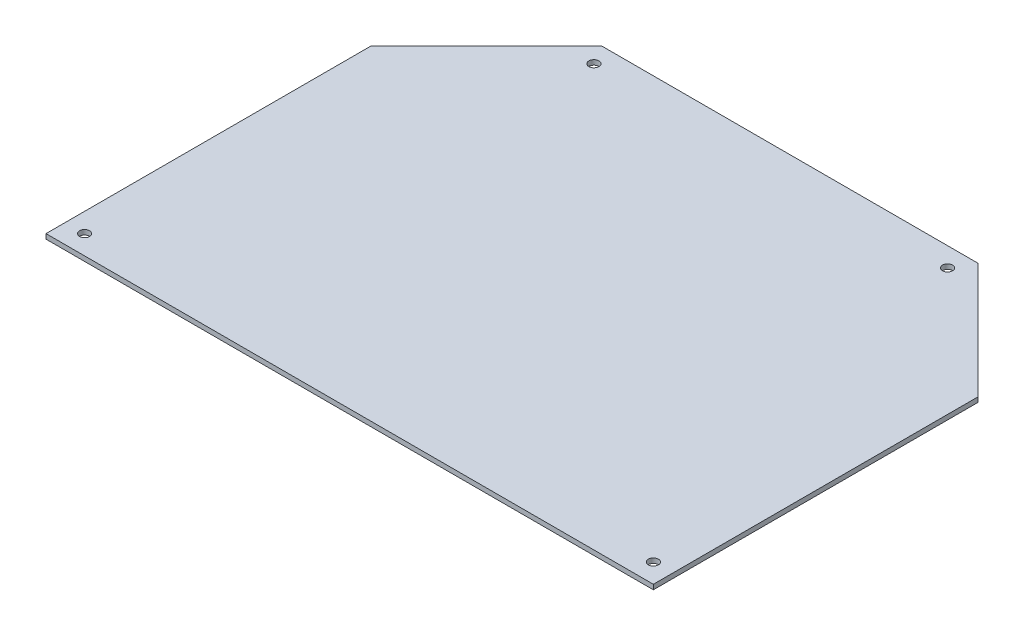
ISO-10303-21;
HEADER;
FILE_DESCRIPTION(('STEP AP214'),'2;1');
FILE_NAME('part.step','',(''),(''),'','','');
FILE_SCHEMA(('AUTOMOTIVE_DESIGN { 1 0 10303 214 1 1 1 1 }'));
ENDSEC;
DATA;
#1=APPLICATION_CONTEXT('core data for automotive mechanical design processes');
#2=APPLICATION_PROTOCOL_DEFINITION('international standard','automotive_design',2000,#1);
#3=PRODUCT_CONTEXT('',#1,'mechanical');
#4=PRODUCT('Part','Part','',(#3));
#5=PRODUCT_RELATED_PRODUCT_CATEGORY('part','',(#4));
#6=PRODUCT_DEFINITION_FORMATION('','',#4);
#7=PRODUCT_DEFINITION_CONTEXT('part definition',#1,'design');
#8=PRODUCT_DEFINITION('design','',#6,#7);
#9=PRODUCT_DEFINITION_SHAPE('','',#8);
#10=(LENGTH_UNIT() NAMED_UNIT(*) SI_UNIT(.MILLI.,.METRE.));
#11=(NAMED_UNIT(*) PLANE_ANGLE_UNIT() SI_UNIT($,.RADIAN.));
#12=(NAMED_UNIT(*) SI_UNIT($,.STERADIAN.) SOLID_ANGLE_UNIT());
#13=UNCERTAINTY_MEASURE_WITH_UNIT(LENGTH_MEASURE(1.E-05),#10,'distance_accuracy_value','');
#14=(GEOMETRIC_REPRESENTATION_CONTEXT(3) GLOBAL_UNCERTAINTY_ASSIGNED_CONTEXT((#13)) GLOBAL_UNIT_ASSIGNED_CONTEXT((#10,
#11,#12)) REPRESENTATION_CONTEXT('',''));
#15=CARTESIAN_POINT('',(0.,0.,0.));
#16=DIRECTION('',(0.,0.,1.));
#17=DIRECTION('',(1.,0.,0.));
#18=AXIS2_PLACEMENT_3D('',#15,#16,#17);
#19=CARTESIAN_POINT('',(200.,-3.175,145.));
#20=DIRECTION('',(1.,0.,0.));
#21=DIRECTION('',(0.,0.,-1.));
#22=AXIS2_PLACEMENT_3D('',#19,#20,#21);
#23=PLANE('',#22);
#24=DIRECTION('',(0.,1.,0.));
#25=VECTOR('',#24,1.);
#26=CARTESIAN_POINT('',(200.,-10.,-68.8));
#27=LINE('',#26,#25);
#28=CARTESIAN_POINT('',(200.,-3.175,-68.8));
#29=VERTEX_POINT('',#28);
#30=CARTESIAN_POINT('',(200.,0.,-68.8));
#31=VERTEX_POINT('',#30);
#32=EDGE_CURVE('E92',#29,#31,#27,.T.);
#33=ORIENTED_EDGE('',*,*,#32,.T.);
#34=DIRECTION('',(0.,0.,-1.));
#35=VECTOR('',#34,1.);
#36=CARTESIAN_POINT('',(200.,0.,145.));
#37=LINE('',#36,#35);
#38=CARTESIAN_POINT('',(200.,0.,145.));
#39=VERTEX_POINT('',#38);
#40=EDGE_CURVE('E103',#39,#31,#37,.T.);
#41=ORIENTED_EDGE('',*,*,#40,.F.);
#42=DIRECTION('',(0.,1.,0.));
#43=VECTOR('',#42,1.);
#44=CARTESIAN_POINT('',(200.,-3.175,145.));
#45=LINE('',#44,#43);
#46=CARTESIAN_POINT('',(200.,-3.175,145.));
#47=VERTEX_POINT('',#46);
#48=EDGE_CURVE('E11',#47,#39,#45,.T.);
#49=ORIENTED_EDGE('',*,*,#48,.F.);
#50=DIRECTION('',(0.,0.,-1.));
#51=VECTOR('',#50,1.);
#52=CARTESIAN_POINT('',(200.,-3.175,145.));
#53=LINE('',#52,#51);
#54=EDGE_CURVE('E106',#47,#29,#53,.T.);
#55=ORIENTED_EDGE('',*,*,#54,.T.);
#56=EDGE_LOOP('',(#33,#41,#49,#55));
#57=FACE_BOUND('',#56,.T.);
#58=ADVANCED_FACE('F39',(#57),#23,.T.);
#59=CARTESIAN_POINT('',(-200.,-3.175,145.));
#60=DIRECTION('',(0.,0.,1.));
#61=DIRECTION('',(1.,0.,0.));
#62=AXIS2_PLACEMENT_3D('',#59,#60,#61);
#63=PLANE('',#62);
#64=DIRECTION('',(1.,0.,0.));
#65=VECTOR('',#64,1.);
#66=CARTESIAN_POINT('',(-200.,0.,145.));
#67=LINE('',#66,#65);
#68=CARTESIAN_POINT('',(-200.,0.,145.));
#69=VERTEX_POINT('',#68);
#70=EDGE_CURVE('E110',#69,#39,#67,.T.);
#71=ORIENTED_EDGE('',*,*,#70,.F.);
#72=DIRECTION('',(0.,1.,0.));
#73=VECTOR('',#72,1.);
#74=CARTESIAN_POINT('',(-200.,-3.175,145.));
#75=LINE('',#74,#73);
#76=CARTESIAN_POINT('',(-200.,-3.175,145.));
#77=VERTEX_POINT('',#76);
#78=EDGE_CURVE('E47',#77,#69,#75,.T.);
#79=ORIENTED_EDGE('',*,*,#78,.F.);
#80=DIRECTION('',(1.,0.,0.));
#81=VECTOR('',#80,1.);
#82=CARTESIAN_POINT('',(-200.,-3.175,145.));
#83=LINE('',#82,#81);
#84=EDGE_CURVE('E119',#77,#47,#83,.T.);
#85=ORIENTED_EDGE('',*,*,#84,.T.);
#86=ORIENTED_EDGE('',*,*,#48,.T.);
#87=EDGE_LOOP('',(#71,#79,#85,#86));
#88=FACE_BOUND('',#87,.T.);
#89=ADVANCED_FACE('F162',(#88),#63,.T.);
#90=CARTESIAN_POINT('',(-200.,-3.175,145.));
#91=DIRECTION('',(-1.,0.,0.));
#92=DIRECTION('',(0.,0.,1.));
#93=AXIS2_PLACEMENT_3D('',#90,#91,#92);
#94=PLANE('',#93);
#95=DIRECTION('',(0.,1.,0.));
#96=VECTOR('',#95,1.);
#97=CARTESIAN_POINT('',(-200.,-10.,-68.8));
#98=LINE('',#97,#96);
#99=CARTESIAN_POINT('',(-200.,-3.175,-68.8));
#100=VERTEX_POINT('',#99);
#101=CARTESIAN_POINT('',(-200.,0.,-68.8));
#102=VERTEX_POINT('',#101);
#103=EDGE_CURVE('E55',#100,#102,#98,.T.);
#104=ORIENTED_EDGE('',*,*,#103,.F.);
#105=DIRECTION('',(0.,0.,1.));
#106=VECTOR('',#105,1.);
#107=CARTESIAN_POINT('',(-200.,-3.175,145.));
#108=LINE('',#107,#106);
#109=EDGE_CURVE('E155',#100,#77,#108,.T.);
#110=ORIENTED_EDGE('',*,*,#109,.T.);
#111=ORIENTED_EDGE('',*,*,#78,.T.);
#112=DIRECTION('',(0.,0.,1.));
#113=VECTOR('',#112,1.);
#114=CARTESIAN_POINT('',(-200.,0.,145.));
#115=LINE('',#114,#113);
#116=EDGE_CURVE('E114',#102,#69,#115,.T.);
#117=ORIENTED_EDGE('',*,*,#116,.F.);
#118=EDGE_LOOP('',(#104,#110,#111,#117));
#119=FACE_BOUND('',#118,.T.);
#120=ADVANCED_FACE('F170',(#119),#94,.T.);
#121=CARTESIAN_POINT('',(-200.,-3.175,-145.));
#122=DIRECTION('',(0.,0.,-1.));
#123=DIRECTION('',(-1.,0.,0.));
#124=AXIS2_PLACEMENT_3D('',#121,#122,#123);
#125=PLANE('',#124);
#126=DIRECTION('',(0.,1.,0.));
#127=VECTOR('',#126,1.);
#128=CARTESIAN_POINT('',(123.8,-10.,-145.));
#129=LINE('',#128,#127);
#130=CARTESIAN_POINT('',(123.8,-3.175,-145.));
#131=VERTEX_POINT('',#130);
#132=CARTESIAN_POINT('',(123.8,0.,-145.));
#133=VERTEX_POINT('',#132);
#134=EDGE_CURVE('E63',#131,#133,#129,.T.);
#135=ORIENTED_EDGE('',*,*,#134,.F.);
#136=DIRECTION('',(-1.,0.,0.));
#137=VECTOR('',#136,1.);
#138=CARTESIAN_POINT('',(-200.,-3.175,-145.));
#139=LINE('',#138,#137);
#140=CARTESIAN_POINT('',(-123.8,-3.175,-145.));
#141=VERTEX_POINT('',#140);
#142=EDGE_CURVE('E153',#131,#141,#139,.T.);
#143=ORIENTED_EDGE('',*,*,#142,.T.);
#144=DIRECTION('',(0.,1.,0.));
#145=VECTOR('',#144,1.);
#146=CARTESIAN_POINT('',(-123.8,-10.,-145.));
#147=LINE('',#146,#145);
#148=CARTESIAN_POINT('',(-123.8,0.,-145.));
#149=VERTEX_POINT('',#148);
#150=EDGE_CURVE('E98',#141,#149,#147,.T.);
#151=ORIENTED_EDGE('',*,*,#150,.T.);
#152=DIRECTION('',(-1.,0.,0.));
#153=VECTOR('',#152,1.);
#154=CARTESIAN_POINT('',(-200.,0.,-145.));
#155=LINE('',#154,#153);
#156=EDGE_CURVE('E111',#133,#149,#155,.T.);
#157=ORIENTED_EDGE('',*,*,#156,.F.);
#158=EDGE_LOOP('',(#135,#143,#151,#157));
#159=FACE_BOUND('',#158,.T.);
#160=ADVANCED_FACE('F168',(#159),#125,.T.);
#161=CARTESIAN_POINT('',(0.,-3.175,0.));
#162=DIRECTION('',(0.,-1.,0.));
#163=DIRECTION('',(0.,0.,-1.));
#164=AXIS2_PLACEMENT_3D('',#161,#162,#163);
#165=PLANE('',#164);
#166=CARTESIAN_POINT('',(-187.3,-3.175,132.3));
#167=DIRECTION('',(0.,-1.,0.));
#168=DIRECTION('',(0.,0.,-1.));
#169=AXIS2_PLACEMENT_3D('',#166,#167,#168);
#170=CIRCLE('',#169,3.3);
#171=CARTESIAN_POINT('',(-187.3,-3.175,129.));
#172=VERTEX_POINT('',#171);
#173=EDGE_CURVE('E293',#172,#172,#170,.T.);
#174=ORIENTED_EDGE('',*,*,#173,.F.);
#175=EDGE_LOOP('',(#174));
#176=FACE_BOUND('',#175,.T.);
#177=CARTESIAN_POINT('',(187.3,-3.175,132.3));
#178=DIRECTION('',(0.,-1.,0.));
#179=DIRECTION('',(0.,0.,-1.));
#180=AXIS2_PLACEMENT_3D('',#177,#178,#179);
#181=CIRCLE('',#180,3.3);
#182=CARTESIAN_POINT('',(187.3,-3.175,129.));
#183=VERTEX_POINT('',#182);
#184=EDGE_CURVE('E42',#183,#183,#181,.T.);
#185=ORIENTED_EDGE('',*,*,#184,.F.);
#186=EDGE_LOOP('',(#185));
#187=FACE_BOUND('',#186,.T.);
#188=CARTESIAN_POINT('',(116.467651581292,-3.175,-132.3));
#189=DIRECTION('',(0.,-1.,0.));
#190=DIRECTION('',(0.,0.,-1.));
#191=AXIS2_PLACEMENT_3D('',#188,#189,#190);
#192=CIRCLE('',#191,3.3);
#193=CARTESIAN_POINT('',(116.467651581292,-3.175,-135.6));
#194=VERTEX_POINT('',#193);
#195=EDGE_CURVE('E125',#194,#194,#192,.T.);
#196=ORIENTED_EDGE('',*,*,#195,.F.);
#197=EDGE_LOOP('',(#196));
#198=FACE_BOUND('',#197,.T.);
#199=CARTESIAN_POINT('',(-116.467651581292,-3.175,-132.3));
#200=DIRECTION('',(0.,-1.,0.));
#201=DIRECTION('',(0.,0.,-1.));
#202=AXIS2_PLACEMENT_3D('',#199,#200,#201);
#203=CIRCLE('',#202,3.3);
#204=CARTESIAN_POINT('',(-116.467651581292,-3.175,-135.6));
#205=VERTEX_POINT('',#204);
#206=EDGE_CURVE('E132',#205,#205,#203,.T.);
#207=ORIENTED_EDGE('',*,*,#206,.F.);
#208=EDGE_LOOP('',(#207));
#209=FACE_BOUND('',#208,.T.);
#210=DIRECTION('',(-0.707106781186548,0.,-0.707106781186548));
#211=VECTOR('',#210,1.);
#212=CARTESIAN_POINT('',(134.4,-3.175,-134.4));
#213=LINE('',#212,#211);
#214=EDGE_CURVE('E112',#29,#131,#213,.T.);
#215=ORIENTED_EDGE('',*,*,#214,.F.);
#216=ORIENTED_EDGE('',*,*,#54,.F.);
#217=ORIENTED_EDGE('',*,*,#84,.F.);
#218=ORIENTED_EDGE('',*,*,#109,.F.);
#219=DIRECTION('',(-0.707106781186548,0.,0.707106781186547));
#220=VECTOR('',#219,1.);
#221=CARTESIAN_POINT('',(-134.4,-3.175,-134.4));
#222=LINE('',#221,#220);
#223=EDGE_CURVE('E116',#141,#100,#222,.T.);
#224=ORIENTED_EDGE('',*,*,#223,.F.);
#225=ORIENTED_EDGE('',*,*,#142,.F.);
#226=EDGE_LOOP('',(#215,#216,#217,#218,#224,#225));
#227=FACE_BOUND('',#226,.T.);
#228=ADVANCED_FACE('F164',(#176,#187,#198,#209,#227),#165,.T.);
#229=CARTESIAN_POINT('',(0.,0.,0.));
#230=DIRECTION('',(0.,-1.,0.));
#231=DIRECTION('',(0.,0.,-1.));
#232=AXIS2_PLACEMENT_3D('',#229,#230,#231);
#233=PLANE('',#232);
#234=CARTESIAN_POINT('',(-187.3,0.,132.3));
#235=DIRECTION('',(0.,1.,0.));
#236=DIRECTION('',(0.,0.,1.));
#237=AXIS2_PLACEMENT_3D('',#234,#235,#236);
#238=CIRCLE('',#237,3.3);
#239=CARTESIAN_POINT('',(-187.3,0.,135.6));
#240=VERTEX_POINT('',#239);
#241=EDGE_CURVE('E296',#240,#240,#238,.T.);
#242=ORIENTED_EDGE('',*,*,#241,.F.);
#243=EDGE_LOOP('',(#242));
#244=FACE_BOUND('',#243,.T.);
#245=CARTESIAN_POINT('',(187.3,0.,132.3));
#246=DIRECTION('',(0.,1.,0.));
#247=DIRECTION('',(0.,0.,1.));
#248=AXIS2_PLACEMENT_3D('',#245,#246,#247);
#249=CIRCLE('',#248,3.3);
#250=CARTESIAN_POINT('',(187.3,0.,135.6));
#251=VERTEX_POINT('',#250);
#252=EDGE_CURVE('E139',#251,#251,#249,.T.);
#253=ORIENTED_EDGE('',*,*,#252,.F.);
#254=EDGE_LOOP('',(#253));
#255=FACE_BOUND('',#254,.T.);
#256=CARTESIAN_POINT('',(116.467651581292,0.,-132.3));
#257=DIRECTION('',(0.,1.,0.));
#258=DIRECTION('',(0.,0.,1.));
#259=AXIS2_PLACEMENT_3D('',#256,#257,#258);
#260=CIRCLE('',#259,3.3);
#261=CARTESIAN_POINT('',(116.467651581292,0.,-129.));
#262=VERTEX_POINT('',#261);
#263=EDGE_CURVE('E128',#262,#262,#260,.T.);
#264=ORIENTED_EDGE('',*,*,#263,.F.);
#265=EDGE_LOOP('',(#264));
#266=FACE_BOUND('',#265,.T.);
#267=CARTESIAN_POINT('',(-116.467651581292,0.,-132.3));
#268=DIRECTION('',(0.,1.,0.));
#269=DIRECTION('',(0.,0.,1.));
#270=AXIS2_PLACEMENT_3D('',#267,#268,#269);
#271=CIRCLE('',#270,3.3);
#272=CARTESIAN_POINT('',(-116.467651581292,0.,-129.));
#273=VERTEX_POINT('',#272);
#274=EDGE_CURVE('E127',#273,#273,#271,.T.);
#275=ORIENTED_EDGE('',*,*,#274,.F.);
#276=EDGE_LOOP('',(#275));
#277=FACE_BOUND('',#276,.T.);
#278=ORIENTED_EDGE('',*,*,#40,.T.);
#279=DIRECTION('',(0.707106781186547,0.,0.707106781186547));
#280=VECTOR('',#279,1.);
#281=CARTESIAN_POINT('',(123.8,0.,-145.));
#282=LINE('',#281,#280);
#283=EDGE_CURVE('E89',#133,#31,#282,.T.);
#284=ORIENTED_EDGE('',*,*,#283,.F.);
#285=ORIENTED_EDGE('',*,*,#156,.T.);
#286=DIRECTION('',(0.707106781186548,0.,-0.707106781186548));
#287=VECTOR('',#286,1.);
#288=CARTESIAN_POINT('',(-123.8,0.,-145.));
#289=LINE('',#288,#287);
#290=EDGE_CURVE('E144',#102,#149,#289,.T.);
#291=ORIENTED_EDGE('',*,*,#290,.F.);
#292=ORIENTED_EDGE('',*,*,#116,.T.);
#293=ORIENTED_EDGE('',*,*,#70,.T.);
#294=EDGE_LOOP('',(#278,#284,#285,#291,#292,#293));
#295=FACE_BOUND('',#294,.T.);
#296=ADVANCED_FACE('F108',(#244,#255,#266,#277,#295),#233,.F.);
#297=CARTESIAN_POINT('',(-123.8,-10.,-145.));
#298=DIRECTION('',(0.707106781186548,0.,0.707106781186548));
#299=DIRECTION('',(0.707106781186548,0.,-0.707106781186547));
#300=AXIS2_PLACEMENT_3D('',#297,#298,#299);
#301=PLANE('',#300);
#302=ORIENTED_EDGE('',*,*,#223,.T.);
#303=ORIENTED_EDGE('',*,*,#103,.T.);
#304=ORIENTED_EDGE('',*,*,#290,.T.);
#305=ORIENTED_EDGE('',*,*,#150,.F.);
#306=EDGE_LOOP('',(#302,#303,#304,#305));
#307=FACE_BOUND('',#306,.T.);
#308=ADVANCED_FACE('F226',(#307),#301,.F.);
#309=CARTESIAN_POINT('',(123.8,-10.,-145.));
#310=DIRECTION('',(-0.707106781186548,0.,0.707106781186548));
#311=DIRECTION('',(0.707106781186548,0.,0.707106781186548));
#312=AXIS2_PLACEMENT_3D('',#309,#310,#311);
#313=PLANE('',#312);
#314=ORIENTED_EDGE('',*,*,#214,.T.);
#315=ORIENTED_EDGE('',*,*,#134,.T.);
#316=ORIENTED_EDGE('',*,*,#283,.T.);
#317=ORIENTED_EDGE('',*,*,#32,.F.);
#318=EDGE_LOOP('',(#314,#315,#316,#317));
#319=FACE_BOUND('',#318,.T.);
#320=ADVANCED_FACE('F91',(#319),#313,.F.);
#321=CARTESIAN_POINT('',(-116.467651581292,0.,-132.3));
#322=DIRECTION('',(0.,1.,0.));
#323=DIRECTION('',(0.,0.,1.));
#324=AXIS2_PLACEMENT_3D('',#321,#322,#323);
#325=CYLINDRICAL_SURFACE('',#324,3.3);
#326=ORIENTED_EDGE('',*,*,#206,.T.);
#327=EDGE_LOOP('',(#326));
#328=FACE_BOUND('',#327,.T.);
#329=ORIENTED_EDGE('',*,*,#274,.T.);
#330=EDGE_LOOP('',(#329));
#331=FACE_BOUND('',#330,.T.);
#332=ADVANCED_FACE('F245',(#328,#331),#325,.F.);
#333=CARTESIAN_POINT('',(116.467651581292,0.,-132.3));
#334=DIRECTION('',(0.,1.,0.));
#335=DIRECTION('',(0.,0.,1.));
#336=AXIS2_PLACEMENT_3D('',#333,#334,#335);
#337=CYLINDRICAL_SURFACE('',#336,3.3);
#338=ORIENTED_EDGE('',*,*,#195,.T.);
#339=EDGE_LOOP('',(#338));
#340=FACE_BOUND('',#339,.T.);
#341=ORIENTED_EDGE('',*,*,#263,.T.);
#342=EDGE_LOOP('',(#341));
#343=FACE_BOUND('',#342,.T.);
#344=ADVANCED_FACE('F253',(#340,#343),#337,.F.);
#345=CARTESIAN_POINT('',(187.3,0.,132.3));
#346=DIRECTION('',(0.,1.,0.));
#347=DIRECTION('',(0.,0.,1.));
#348=AXIS2_PLACEMENT_3D('',#345,#346,#347);
#349=CYLINDRICAL_SURFACE('',#348,3.3);
#350=ORIENTED_EDGE('',*,*,#184,.T.);
#351=EDGE_LOOP('',(#350));
#352=FACE_BOUND('',#351,.T.);
#353=ORIENTED_EDGE('',*,*,#252,.T.);
#354=EDGE_LOOP('',(#353));
#355=FACE_BOUND('',#354,.T.);
#356=ADVANCED_FACE('F262',(#352,#355),#349,.F.);
#357=CARTESIAN_POINT('',(-187.3,0.,132.3));
#358=DIRECTION('',(0.,1.,0.));
#359=DIRECTION('',(0.,0.,1.));
#360=AXIS2_PLACEMENT_3D('',#357,#358,#359);
#361=CYLINDRICAL_SURFACE('',#360,3.3);
#362=ORIENTED_EDGE('',*,*,#173,.T.);
#363=EDGE_LOOP('',(#362));
#364=FACE_BOUND('',#363,.T.);
#365=ORIENTED_EDGE('',*,*,#241,.T.);
#366=EDGE_LOOP('',(#365));
#367=FACE_BOUND('',#366,.T.);
#368=ADVANCED_FACE('F270',(#364,#367),#361,.F.);
#369=CLOSED_SHELL('',(#58,#89,#120,#160,#228,#296,#308,#320,#332,#344,#356,#368));
#370=MANIFOLD_SOLID_BREP('B2',#369);
#371=ADVANCED_BREP_SHAPE_REPRESENTATION('',(#18,#370),#14);
#372=SHAPE_DEFINITION_REPRESENTATION(#9,#371);
ENDSEC;
END-ISO-10303-21;
